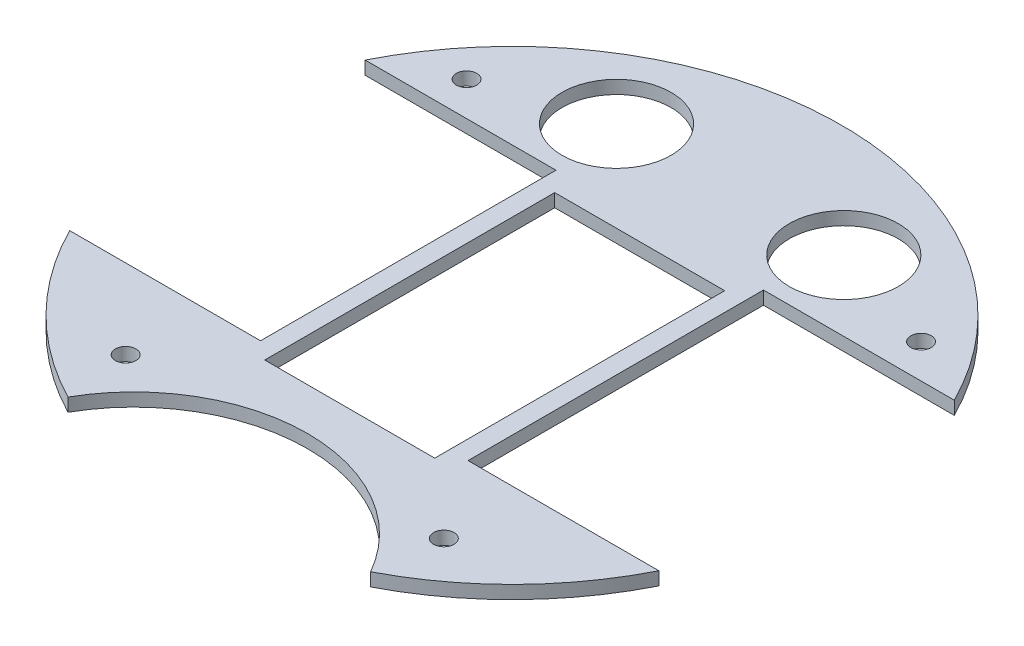
ISO-10303-21;
HEADER;
FILE_DESCRIPTION(('STEP AP214'),'2;1');
FILE_NAME('part.step','',(''),(''),'','','');
FILE_SCHEMA(('AUTOMOTIVE_DESIGN { 1 0 10303 214 1 1 1 1 }'));
ENDSEC;
DATA;
#1=APPLICATION_CONTEXT('core data for automotive mechanical design processes');
#2=APPLICATION_PROTOCOL_DEFINITION('international standard','automotive_design',2000,#1);
#3=PRODUCT_CONTEXT('',#1,'mechanical');
#4=PRODUCT('Part','Part','',(#3));
#5=PRODUCT_RELATED_PRODUCT_CATEGORY('part','',(#4));
#6=PRODUCT_DEFINITION_FORMATION('','',#4);
#7=PRODUCT_DEFINITION_CONTEXT('part definition',#1,'design');
#8=PRODUCT_DEFINITION('design','',#6,#7);
#9=PRODUCT_DEFINITION_SHAPE('','',#8);
#10=(LENGTH_UNIT() NAMED_UNIT(*) SI_UNIT(.MILLI.,.METRE.));
#11=(NAMED_UNIT(*) PLANE_ANGLE_UNIT() SI_UNIT($,.RADIAN.));
#12=(NAMED_UNIT(*) SI_UNIT($,.STERADIAN.) SOLID_ANGLE_UNIT());
#13=UNCERTAINTY_MEASURE_WITH_UNIT(LENGTH_MEASURE(1.E-05),#10,'distance_accuracy_value','');
#14=(GEOMETRIC_REPRESENTATION_CONTEXT(3) GLOBAL_UNCERTAINTY_ASSIGNED_CONTEXT((#13)) GLOBAL_UNIT_ASSIGNED_CONTEXT((#10,
#11,#12)) REPRESENTATION_CONTEXT('',''));
#15=CARTESIAN_POINT('',(0.,0.,0.));
#16=DIRECTION('',(0.,0.,1.));
#17=DIRECTION('',(1.,0.,0.));
#18=AXIS2_PLACEMENT_3D('',#15,#16,#17);
#19=CARTESIAN_POINT('',(0.,2.9,0.));
#20=DIRECTION('',(0.,-1.,0.));
#21=DIRECTION('',(0.,0.,-1.));
#22=AXIS2_PLACEMENT_3D('',#19,#20,#21);
#23=CYLINDRICAL_SURFACE('',#22,72.5);
#24=CARTESIAN_POINT('',(0.,0.,0.));
#25=DIRECTION('',(0.,1.,0.));
#26=DIRECTION('',(0.,0.,1.));
#27=AXIS2_PLACEMENT_3D('',#24,#25,#26);
#28=CIRCLE('',#27,72.5);
#29=CARTESIAN_POINT('',(33.2911053697012,0.,64.4045984636458));
#30=VERTEX_POINT('',#29);
#31=CARTESIAN_POINT('',(64.8074069840786,0.,32.4999999999999));
#32=VERTEX_POINT('',#31);
#33=EDGE_CURVE('E156',#30,#32,#28,.T.);
#34=ORIENTED_EDGE('',*,*,#33,.T.);
#35=DIRECTION('',(0.,1.,0.));
#36=VECTOR('',#35,1.);
#37=CARTESIAN_POINT('',(64.8074069840786,0.,32.4999999999999));
#38=LINE('',#37,#36);
#39=CARTESIAN_POINT('',(64.8074069840786,2.9,32.4999999999999));
#40=VERTEX_POINT('',#39);
#41=EDGE_CURVE('E231',#32,#40,#38,.T.);
#42=ORIENTED_EDGE('',*,*,#41,.T.);
#43=CARTESIAN_POINT('',(0.,2.9,0.));
#44=DIRECTION('',(0.,1.,0.));
#45=DIRECTION('',(0.,0.,1.));
#46=AXIS2_PLACEMENT_3D('',#43,#44,#45);
#47=CIRCLE('',#46,72.5);
#48=CARTESIAN_POINT('',(33.2911053697012,2.9,64.4045984636458));
#49=VERTEX_POINT('',#48);
#50=EDGE_CURVE('E165',#49,#40,#47,.T.);
#51=ORIENTED_EDGE('',*,*,#50,.F.);
#52=DIRECTION('',(0.,-1.,0.));
#53=VECTOR('',#52,1.);
#54=CARTESIAN_POINT('',(33.2911053697012,2.9,64.4045984636458));
#55=LINE('',#54,#53);
#56=EDGE_CURVE('E11',#49,#30,#55,.T.);
#57=ORIENTED_EDGE('',*,*,#56,.T.);
#58=EDGE_LOOP('',(#34,#42,#51,#57));
#59=FACE_BOUND('',#58,.T.);
#60=ADVANCED_FACE('F32',(#59),#23,.T.);
#61=CARTESIAN_POINT('',(64.8074069840786,2.9,-32.5));
#62=VERTEX_POINT('',#61);
#63=CARTESIAN_POINT('',(-64.8074069840786,2.9,-32.5));
#64=VERTEX_POINT('',#63);
#65=EDGE_CURVE('E149',#62,#64,#47,.T.);
#66=ORIENTED_EDGE('',*,*,#65,.F.);
#67=DIRECTION('',(0.,1.,0.));
#68=VECTOR('',#67,1.);
#69=CARTESIAN_POINT('',(64.8074069840786,0.,-32.5));
#70=LINE('',#69,#68);
#71=CARTESIAN_POINT('',(64.8074069840786,0.,-32.5));
#72=VERTEX_POINT('',#71);
#73=EDGE_CURVE('E136',#72,#62,#70,.T.);
#74=ORIENTED_EDGE('',*,*,#73,.F.);
#75=CARTESIAN_POINT('',(-64.8074069840786,0.,-32.5));
#76=VERTEX_POINT('',#75);
#77=EDGE_CURVE('E147',#72,#76,#28,.T.);
#78=ORIENTED_EDGE('',*,*,#77,.T.);
#79=DIRECTION('',(0.,1.,0.));
#80=VECTOR('',#79,1.);
#81=CARTESIAN_POINT('',(-64.8074069840786,0.,-32.5));
#82=LINE('',#81,#80);
#83=EDGE_CURVE('E218',#76,#64,#82,.T.);
#84=ORIENTED_EDGE('',*,*,#83,.T.);
#85=EDGE_LOOP('',(#66,#74,#78,#84));
#86=FACE_BOUND('',#85,.T.);
#87=ADVANCED_FACE('F145',(#86),#23,.T.);
#88=CARTESIAN_POINT('',(0.,2.9,83.2397996376034));
#89=DIRECTION('',(0.,-1.,0.));
#90=DIRECTION('',(0.,0.,-1.));
#91=AXIS2_PLACEMENT_3D('',#88,#89,#90);
#92=CYLINDRICAL_SURFACE('',#91,38.25);
#93=CARTESIAN_POINT('',(0.,0.,83.2397996376034));
#94=DIRECTION('',(0.,-1.,0.));
#95=DIRECTION('',(0.,0.,1.));
#96=AXIS2_PLACEMENT_3D('',#93,#94,#95);
#97=CIRCLE('',#96,38.25);
#98=CARTESIAN_POINT('',(-33.2911053697012,0.,64.4045984636458));
#99=VERTEX_POINT('',#98);
#100=EDGE_CURVE('E161',#99,#30,#97,.T.);
#101=ORIENTED_EDGE('',*,*,#100,.T.);
#102=ORIENTED_EDGE('',*,*,#56,.F.);
#103=CARTESIAN_POINT('',(0.,2.9,83.2397996376034));
#104=DIRECTION('',(0.,-1.,0.));
#105=DIRECTION('',(0.,0.,1.));
#106=AXIS2_PLACEMENT_3D('',#103,#104,#105);
#107=CIRCLE('',#106,38.25);
#108=CARTESIAN_POINT('',(-33.2911053697012,2.9,64.4045984636458));
#109=VERTEX_POINT('',#108);
#110=EDGE_CURVE('E160',#109,#49,#107,.T.);
#111=ORIENTED_EDGE('',*,*,#110,.F.);
#112=DIRECTION('',(0.,-1.,0.));
#113=VECTOR('',#112,1.);
#114=CARTESIAN_POINT('',(-33.2911053697012,2.9,64.4045984636458));
#115=LINE('',#114,#113);
#116=EDGE_CURVE('E40',#109,#99,#115,.T.);
#117=ORIENTED_EDGE('',*,*,#116,.T.);
#118=EDGE_LOOP('',(#101,#102,#111,#117));
#119=FACE_BOUND('',#118,.T.);
#120=ADVANCED_FACE('F34',(#119),#92,.F.);
#121=CARTESIAN_POINT('',(-64.8074069840787,2.9,32.4999999999999));
#122=VERTEX_POINT('',#121);
#123=EDGE_CURVE('E172',#122,#109,#47,.T.);
#124=ORIENTED_EDGE('',*,*,#123,.F.);
#125=DIRECTION('',(0.,1.,0.));
#126=VECTOR('',#125,1.);
#127=CARTESIAN_POINT('',(-64.8074069840787,0.,32.4999999999999));
#128=LINE('',#127,#126);
#129=CARTESIAN_POINT('',(-64.8074069840787,0.,32.4999999999999));
#130=VERTEX_POINT('',#129);
#131=EDGE_CURVE('E203',#130,#122,#128,.T.);
#132=ORIENTED_EDGE('',*,*,#131,.F.);
#133=EDGE_CURVE('E157',#130,#99,#28,.T.);
#134=ORIENTED_EDGE('',*,*,#133,.T.);
#135=ORIENTED_EDGE('',*,*,#116,.F.);
#136=EDGE_LOOP('',(#124,#132,#134,#135));
#137=FACE_BOUND('',#136,.T.);
#138=ADVANCED_FACE('F302',(#137),#23,.T.);
#139=CARTESIAN_POINT('',(0.,2.9,41.6198998188017));
#140=DIRECTION('',(0.,1.,0.));
#141=DIRECTION('',(0.,0.,1.));
#142=AXIS2_PLACEMENT_3D('',#139,#140,#141);
#143=PLANE('',#142);
#144=CARTESIAN_POINT('',(-35.,2.9,50.));
#145=DIRECTION('',(0.,1.,0.));
#146=DIRECTION('',(0.,0.,1.));
#147=AXIS2_PLACEMENT_3D('',#144,#145,#146);
#148=CIRCLE('',#147,2.25);
#149=CARTESIAN_POINT('',(-35.,2.9,52.25));
#150=VERTEX_POINT('',#149);
#151=EDGE_CURVE('E268',#150,#150,#148,.T.);
#152=ORIENTED_EDGE('',*,*,#151,.F.);
#153=EDGE_LOOP('',(#152));
#154=FACE_BOUND('',#153,.T.);
#155=CARTESIAN_POINT('',(-50.,2.9,-40.));
#156=DIRECTION('',(0.,1.,0.));
#157=DIRECTION('',(0.,0.,1.));
#158=AXIS2_PLACEMENT_3D('',#155,#156,#157);
#159=CIRCLE('',#158,2.25);
#160=CARTESIAN_POINT('',(-50.,2.9,-37.75));
#161=VERTEX_POINT('',#160);
#162=EDGE_CURVE('E271',#161,#161,#159,.T.);
#163=ORIENTED_EDGE('',*,*,#162,.F.);
#164=EDGE_LOOP('',(#163));
#165=FACE_BOUND('',#164,.T.);
#166=CARTESIAN_POINT('',(50.,2.9,-40.));
#167=DIRECTION('',(0.,1.,0.));
#168=DIRECTION('',(0.,0.,1.));
#169=AXIS2_PLACEMENT_3D('',#166,#167,#168);
#170=CIRCLE('',#169,2.25);
#171=CARTESIAN_POINT('',(50.,2.9,-37.75));
#172=VERTEX_POINT('',#171);
#173=EDGE_CURVE('E274',#172,#172,#170,.T.);
#174=ORIENTED_EDGE('',*,*,#173,.F.);
#175=EDGE_LOOP('',(#174));
#176=FACE_BOUND('',#175,.T.);
#177=CARTESIAN_POINT('',(35.,2.9,50.));
#178=DIRECTION('',(0.,1.,0.));
#179=DIRECTION('',(0.,0.,1.));
#180=AXIS2_PLACEMENT_3D('',#177,#178,#179);
#181=CIRCLE('',#180,2.25);
#182=CARTESIAN_POINT('',(35.,2.9,52.25));
#183=VERTEX_POINT('',#182);
#184=EDGE_CURVE('E260',#183,#183,#181,.T.);
#185=ORIENTED_EDGE('',*,*,#184,.F.);
#186=EDGE_LOOP('',(#185));
#187=FACE_BOUND('',#186,.T.);
#188=CARTESIAN_POINT('',(-25.,2.9,-48.));
#189=DIRECTION('',(0.,1.,0.));
#190=DIRECTION('',(0.,0.,1.));
#191=AXIS2_PLACEMENT_3D('',#188,#189,#190);
#192=CIRCLE('',#191,12.);
#193=CARTESIAN_POINT('',(-25.,2.9,-36.));
#194=VERTEX_POINT('',#193);
#195=EDGE_CURVE('E257',#194,#194,#192,.T.);
#196=ORIENTED_EDGE('',*,*,#195,.F.);
#197=EDGE_LOOP('',(#196));
#198=FACE_BOUND('',#197,.T.);
#199=CARTESIAN_POINT('',(25.,2.9,-48.));
#200=DIRECTION('',(0.,1.,0.));
#201=DIRECTION('',(0.,0.,1.));
#202=AXIS2_PLACEMENT_3D('',#199,#200,#201);
#203=CIRCLE('',#202,12.);
#204=CARTESIAN_POINT('',(25.,2.9,-36.));
#205=VERTEX_POINT('',#204);
#206=EDGE_CURVE('E251',#205,#205,#203,.T.);
#207=ORIENTED_EDGE('',*,*,#206,.F.);
#208=EDGE_LOOP('',(#207));
#209=FACE_BOUND('',#208,.T.);
#210=DIRECTION('',(1.,0.,0.));
#211=VECTOR('',#210,1.);
#212=CARTESIAN_POINT('',(34.6299999999999,2.9,32.5));
#213=LINE('',#212,#211);
#214=CARTESIAN_POINT('',(22.8299999999999,2.9,32.4999999999999));
#215=VERTEX_POINT('',#214);
#216=EDGE_CURVE('E141',#215,#40,#213,.T.);
#217=ORIENTED_EDGE('',*,*,#216,.F.);
#218=DIRECTION('',(0.,0.,1.));
#219=VECTOR('',#218,1.);
#220=CARTESIAN_POINT('',(22.8299999999999,2.9,-32.5));
#221=LINE('',#220,#219);
#222=CARTESIAN_POINT('',(22.8299999999999,2.9,-32.5));
#223=VERTEX_POINT('',#222);
#224=EDGE_CURVE('E242',#223,#215,#221,.T.);
#225=ORIENTED_EDGE('',*,*,#224,.F.);
#226=DIRECTION('',(-1.,0.,0.));
#227=VECTOR('',#226,1.);
#228=CARTESIAN_POINT('',(64.8074069840786,2.9,-32.5));
#229=LINE('',#228,#227);
#230=EDGE_CURVE('E245',#62,#223,#229,.T.);
#231=ORIENTED_EDGE('',*,*,#230,.F.);
#232=ORIENTED_EDGE('',*,*,#65,.T.);
#233=DIRECTION('',(-1.,0.,0.));
#234=VECTOR('',#233,1.);
#235=CARTESIAN_POINT('',(-22.8299999999999,2.9,-32.5));
#236=LINE('',#235,#234);
#237=CARTESIAN_POINT('',(-22.8299999999999,2.9,-32.5));
#238=VERTEX_POINT('',#237);
#239=EDGE_CURVE('E221',#238,#64,#236,.T.);
#240=ORIENTED_EDGE('',*,*,#239,.F.);
#241=DIRECTION('',(0.,0.,-1.));
#242=VECTOR('',#241,1.);
#243=CARTESIAN_POINT('',(-22.8299999999999,2.9,32.4999999999999));
#244=LINE('',#243,#242);
#245=CARTESIAN_POINT('',(-22.8299999999999,2.9,32.4999999999999));
#246=VERTEX_POINT('',#245);
#247=EDGE_CURVE('E225',#246,#238,#244,.T.);
#248=ORIENTED_EDGE('',*,*,#247,.F.);
#249=DIRECTION('',(1.,0.,0.));
#250=VECTOR('',#249,1.);
#251=CARTESIAN_POINT('',(-34.6299999999999,2.9,32.5));
#252=LINE('',#251,#250);
#253=EDGE_CURVE('E228',#122,#246,#252,.T.);
#254=ORIENTED_EDGE('',*,*,#253,.F.);
#255=ORIENTED_EDGE('',*,*,#123,.T.);
#256=ORIENTED_EDGE('',*,*,#110,.T.);
#257=ORIENTED_EDGE('',*,*,#50,.T.);
#258=EDGE_LOOP('',(#217,#225,#231,#232,#240,#248,#254,#255,#256,#257));
#259=FACE_BOUND('',#258,.T.);
#260=DIRECTION('',(0.,0.,1.));
#261=VECTOR('',#260,1.);
#262=CARTESIAN_POINT('',(-18.7,2.9,-28.1));
#263=LINE('',#262,#261);
#264=CARTESIAN_POINT('',(-18.7,2.9,-28.1));
#265=VERTEX_POINT('',#264);
#266=CARTESIAN_POINT('',(-18.7,2.9,35.7));
#267=VERTEX_POINT('',#266);
#268=EDGE_CURVE('E201',#265,#267,#263,.T.);
#269=ORIENTED_EDGE('',*,*,#268,.F.);
#270=DIRECTION('',(-1.,0.,0.));
#271=VECTOR('',#270,1.);
#272=CARTESIAN_POINT('',(18.7,2.9,-28.1));
#273=LINE('',#272,#271);
#274=CARTESIAN_POINT('',(18.7,2.9,-28.1));
#275=VERTEX_POINT('',#274);
#276=EDGE_CURVE('E191',#275,#265,#273,.T.);
#277=ORIENTED_EDGE('',*,*,#276,.F.);
#278=DIRECTION('',(0.,0.,-1.));
#279=VECTOR('',#278,1.);
#280=CARTESIAN_POINT('',(18.7,2.9,35.7));
#281=LINE('',#280,#279);
#282=CARTESIAN_POINT('',(18.7,2.9,35.7));
#283=VERTEX_POINT('',#282);
#284=EDGE_CURVE('E195',#283,#275,#281,.T.);
#285=ORIENTED_EDGE('',*,*,#284,.F.);
#286=DIRECTION('',(1.,0.,0.));
#287=VECTOR('',#286,1.);
#288=CARTESIAN_POINT('',(-18.7,2.9,35.7));
#289=LINE('',#288,#287);
#290=EDGE_CURVE('E198',#267,#283,#289,.T.);
#291=ORIENTED_EDGE('',*,*,#290,.F.);
#292=EDGE_LOOP('',(#269,#277,#285,#291));
#293=FACE_BOUND('',#292,.T.);
#294=ADVANCED_FACE('F308',(#154,#165,#176,#187,#198,#209,#259,#293),#143,.T.);
#295=CARTESIAN_POINT('',(0.,0.,41.6198998188017));
#296=DIRECTION('',(0.,1.,0.));
#297=DIRECTION('',(0.,0.,1.));
#298=AXIS2_PLACEMENT_3D('',#295,#296,#297);
#299=PLANE('',#298);
#300=CARTESIAN_POINT('',(-35.,0.,50.));
#301=DIRECTION('',(0.,1.,0.));
#302=DIRECTION('',(0.,0.,1.));
#303=AXIS2_PLACEMENT_3D('',#300,#301,#302);
#304=CIRCLE('',#303,2.25);
#305=CARTESIAN_POINT('',(-35.,0.,52.25));
#306=VERTEX_POINT('',#305);
#307=EDGE_CURVE('E277',#306,#306,#304,.T.);
#308=ORIENTED_EDGE('',*,*,#307,.T.);
#309=EDGE_LOOP('',(#308));
#310=FACE_BOUND('',#309,.T.);
#311=CARTESIAN_POINT('',(-50.,0.,-40.));
#312=DIRECTION('',(0.,1.,0.));
#313=DIRECTION('',(0.,0.,1.));
#314=AXIS2_PLACEMENT_3D('',#311,#312,#313);
#315=CIRCLE('',#314,2.25);
#316=CARTESIAN_POINT('',(-50.,0.,-37.75));
#317=VERTEX_POINT('',#316);
#318=EDGE_CURVE('E281',#317,#317,#315,.T.);
#319=ORIENTED_EDGE('',*,*,#318,.T.);
#320=EDGE_LOOP('',(#319));
#321=FACE_BOUND('',#320,.T.);
#322=CARTESIAN_POINT('',(50.,0.,-40.));
#323=DIRECTION('',(0.,1.,0.));
#324=DIRECTION('',(0.,0.,1.));
#325=AXIS2_PLACEMENT_3D('',#322,#323,#324);
#326=CIRCLE('',#325,2.25);
#327=CARTESIAN_POINT('',(50.,0.,-37.75));
#328=VERTEX_POINT('',#327);
#329=EDGE_CURVE('E278',#328,#328,#326,.T.);
#330=ORIENTED_EDGE('',*,*,#329,.T.);
#331=EDGE_LOOP('',(#330));
#332=FACE_BOUND('',#331,.T.);
#333=CARTESIAN_POINT('',(35.,0.,50.));
#334=DIRECTION('',(0.,1.,0.));
#335=DIRECTION('',(0.,0.,1.));
#336=AXIS2_PLACEMENT_3D('',#333,#334,#335);
#337=CIRCLE('',#336,2.25);
#338=CARTESIAN_POINT('',(35.,0.,52.25));
#339=VERTEX_POINT('',#338);
#340=EDGE_CURVE('E265',#339,#339,#337,.T.);
#341=ORIENTED_EDGE('',*,*,#340,.T.);
#342=EDGE_LOOP('',(#341));
#343=FACE_BOUND('',#342,.T.);
#344=CARTESIAN_POINT('',(-25.,0.,-48.));
#345=DIRECTION('',(0.,1.,0.));
#346=DIRECTION('',(0.,0.,1.));
#347=AXIS2_PLACEMENT_3D('',#344,#345,#346);
#348=CIRCLE('',#347,12.);
#349=CARTESIAN_POINT('',(-25.,0.,-36.));
#350=VERTEX_POINT('',#349);
#351=EDGE_CURVE('E254',#350,#350,#348,.T.);
#352=ORIENTED_EDGE('',*,*,#351,.T.);
#353=EDGE_LOOP('',(#352));
#354=FACE_BOUND('',#353,.T.);
#355=CARTESIAN_POINT('',(25.,0.,-48.));
#356=DIRECTION('',(0.,1.,0.));
#357=DIRECTION('',(0.,0.,1.));
#358=AXIS2_PLACEMENT_3D('',#355,#356,#357);
#359=CIRCLE('',#358,12.);
#360=CARTESIAN_POINT('',(25.,0.,-36.));
#361=VERTEX_POINT('',#360);
#362=EDGE_CURVE('E247',#361,#361,#359,.T.);
#363=ORIENTED_EDGE('',*,*,#362,.T.);
#364=EDGE_LOOP('',(#363));
#365=FACE_BOUND('',#364,.T.);
#366=DIRECTION('',(-1.,0.,0.));
#367=VECTOR('',#366,1.);
#368=CARTESIAN_POINT('',(18.7,0.,-28.1));
#369=LINE('',#368,#367);
#370=CARTESIAN_POINT('',(18.7,0.,-28.1));
#371=VERTEX_POINT('',#370);
#372=CARTESIAN_POINT('',(-18.7,0.,-28.1));
#373=VERTEX_POINT('',#372);
#374=EDGE_CURVE('E185',#371,#373,#369,.T.);
#375=ORIENTED_EDGE('',*,*,#374,.T.);
#376=DIRECTION('',(0.,0.,1.));
#377=VECTOR('',#376,1.);
#378=CARTESIAN_POINT('',(-18.7,0.,-28.1));
#379=LINE('',#378,#377);
#380=CARTESIAN_POINT('',(-18.7,0.,35.7));
#381=VERTEX_POINT('',#380);
#382=EDGE_CURVE('E194',#373,#381,#379,.T.);
#383=ORIENTED_EDGE('',*,*,#382,.T.);
#384=DIRECTION('',(1.,0.,0.));
#385=VECTOR('',#384,1.);
#386=CARTESIAN_POINT('',(-18.7,0.,35.7));
#387=LINE('',#386,#385);
#388=CARTESIAN_POINT('',(18.7,0.,35.7));
#389=VERTEX_POINT('',#388);
#390=EDGE_CURVE('E209',#381,#389,#387,.T.);
#391=ORIENTED_EDGE('',*,*,#390,.T.);
#392=DIRECTION('',(0.,0.,-1.));
#393=VECTOR('',#392,1.);
#394=CARTESIAN_POINT('',(18.7,0.,35.7));
#395=LINE('',#394,#393);
#396=EDGE_CURVE('E206',#389,#371,#395,.T.);
#397=ORIENTED_EDGE('',*,*,#396,.T.);
#398=EDGE_LOOP('',(#375,#383,#391,#397));
#399=FACE_BOUND('',#398,.T.);
#400=DIRECTION('',(0.,0.,1.));
#401=VECTOR('',#400,1.);
#402=CARTESIAN_POINT('',(22.8299999999999,0.,-32.5));
#403=LINE('',#402,#401);
#404=CARTESIAN_POINT('',(22.8299999999999,0.,-32.5));
#405=VERTEX_POINT('',#404);
#406=CARTESIAN_POINT('',(22.8299999999999,0.,32.4999999999999));
#407=VERTEX_POINT('',#406);
#408=EDGE_CURVE('E47',#405,#407,#403,.T.);
#409=ORIENTED_EDGE('',*,*,#408,.T.);
#410=DIRECTION('',(1.,0.,0.));
#411=VECTOR('',#410,1.);
#412=CARTESIAN_POINT('',(22.8299999999999,0.,32.4999999999999));
#413=LINE('',#412,#411);
#414=EDGE_CURVE('E150',#407,#32,#413,.T.);
#415=ORIENTED_EDGE('',*,*,#414,.T.);
#416=ORIENTED_EDGE('',*,*,#33,.F.);
#417=ORIENTED_EDGE('',*,*,#100,.F.);
#418=ORIENTED_EDGE('',*,*,#133,.F.);
#419=DIRECTION('',(1.,0.,0.));
#420=VECTOR('',#419,1.);
#421=CARTESIAN_POINT('',(-64.8074069840786,0.,32.4999999999999));
#422=LINE('',#421,#420);
#423=CARTESIAN_POINT('',(-22.8299999999999,0.,32.4999999999999));
#424=VERTEX_POINT('',#423);
#425=EDGE_CURVE('E224',#130,#424,#422,.T.);
#426=ORIENTED_EDGE('',*,*,#425,.T.);
#427=DIRECTION('',(0.,0.,-1.));
#428=VECTOR('',#427,1.);
#429=CARTESIAN_POINT('',(-22.8299999999999,0.,32.4999999999999));
#430=LINE('',#429,#428);
#431=CARTESIAN_POINT('',(-22.8299999999999,0.,-32.5));
#432=VERTEX_POINT('',#431);
#433=EDGE_CURVE('E55',#424,#432,#430,.T.);
#434=ORIENTED_EDGE('',*,*,#433,.T.);
#435=DIRECTION('',(-1.,0.,0.));
#436=VECTOR('',#435,1.);
#437=CARTESIAN_POINT('',(-22.8299999999999,0.,-32.5));
#438=LINE('',#437,#436);
#439=EDGE_CURVE('E155',#432,#76,#438,.T.);
#440=ORIENTED_EDGE('',*,*,#439,.T.);
#441=ORIENTED_EDGE('',*,*,#77,.F.);
#442=DIRECTION('',(-1.,0.,0.));
#443=VECTOR('',#442,1.);
#444=CARTESIAN_POINT('',(64.8074069840786,0.,-32.5));
#445=LINE('',#444,#443);
#446=EDGE_CURVE('E132',#72,#405,#445,.T.);
#447=ORIENTED_EDGE('',*,*,#446,.T.);
#448=EDGE_LOOP('',(#409,#415,#416,#417,#418,#426,#434,#440,#441,#447));
#449=FACE_BOUND('',#448,.T.);
#450=ADVANCED_FACE('F153',(#310,#321,#332,#343,#354,#365,#399,#449),#299,.F.);
#451=CARTESIAN_POINT('',(-18.7,0.,-28.1));
#452=DIRECTION('',(-1.,0.,0.));
#453=DIRECTION('',(0.,0.,1.));
#454=AXIS2_PLACEMENT_3D('',#451,#452,#453);
#455=PLANE('',#454);
#456=ORIENTED_EDGE('',*,*,#268,.T.);
#457=DIRECTION('',(0.,1.,0.));
#458=VECTOR('',#457,1.);
#459=CARTESIAN_POINT('',(-18.7,0.,35.7));
#460=LINE('',#459,#458);
#461=EDGE_CURVE('E181',#381,#267,#460,.T.);
#462=ORIENTED_EDGE('',*,*,#461,.F.);
#463=ORIENTED_EDGE('',*,*,#382,.F.);
#464=DIRECTION('',(0.,1.,0.));
#465=VECTOR('',#464,1.);
#466=CARTESIAN_POINT('',(-18.7,0.,-28.1));
#467=LINE('',#466,#465);
#468=EDGE_CURVE('E189',#373,#265,#467,.T.);
#469=ORIENTED_EDGE('',*,*,#468,.T.);
#470=EDGE_LOOP('',(#456,#462,#463,#469));
#471=FACE_BOUND('',#470,.T.);
#472=ADVANCED_FACE('F348',(#471),#455,.F.);
#473=CARTESIAN_POINT('',(18.7,0.,-28.1));
#474=DIRECTION('',(0.,0.,-1.));
#475=DIRECTION('',(-1.,0.,0.));
#476=AXIS2_PLACEMENT_3D('',#473,#474,#475);
#477=PLANE('',#476);
#478=ORIENTED_EDGE('',*,*,#276,.T.);
#479=ORIENTED_EDGE('',*,*,#468,.F.);
#480=ORIENTED_EDGE('',*,*,#374,.F.);
#481=DIRECTION('',(0.,1.,0.));
#482=VECTOR('',#481,1.);
#483=CARTESIAN_POINT('',(18.7,0.,-28.1));
#484=LINE('',#483,#482);
#485=EDGE_CURVE('E187',#371,#275,#484,.T.);
#486=ORIENTED_EDGE('',*,*,#485,.T.);
#487=EDGE_LOOP('',(#478,#479,#480,#486));
#488=FACE_BOUND('',#487,.T.);
#489=ADVANCED_FACE('F345',(#488),#477,.F.);
#490=CARTESIAN_POINT('',(18.7,0.,35.7));
#491=DIRECTION('',(1.,0.,0.));
#492=DIRECTION('',(0.,0.,-1.));
#493=AXIS2_PLACEMENT_3D('',#490,#491,#492);
#494=PLANE('',#493);
#495=ORIENTED_EDGE('',*,*,#284,.T.);
#496=ORIENTED_EDGE('',*,*,#485,.F.);
#497=ORIENTED_EDGE('',*,*,#396,.F.);
#498=DIRECTION('',(0.,1.,0.));
#499=VECTOR('',#498,1.);
#500=CARTESIAN_POINT('',(18.7,0.,35.7));
#501=LINE('',#500,#499);
#502=EDGE_CURVE('E184',#389,#283,#501,.T.);
#503=ORIENTED_EDGE('',*,*,#502,.T.);
#504=EDGE_LOOP('',(#495,#496,#497,#503));
#505=FACE_BOUND('',#504,.T.);
#506=ADVANCED_FACE('F337',(#505),#494,.F.);
#507=CARTESIAN_POINT('',(-18.7,0.,35.7));
#508=DIRECTION('',(0.,0.,1.));
#509=DIRECTION('',(1.,0.,0.));
#510=AXIS2_PLACEMENT_3D('',#507,#508,#509);
#511=PLANE('',#510);
#512=ORIENTED_EDGE('',*,*,#290,.T.);
#513=ORIENTED_EDGE('',*,*,#502,.F.);
#514=ORIENTED_EDGE('',*,*,#390,.F.);
#515=ORIENTED_EDGE('',*,*,#461,.T.);
#516=EDGE_LOOP('',(#512,#513,#514,#515));
#517=FACE_BOUND('',#516,.T.);
#518=ADVANCED_FACE('F330',(#517),#511,.F.);
#519=CARTESIAN_POINT('',(-22.8299999999999,0.,-32.5));
#520=DIRECTION('',(0.,0.,-1.));
#521=DIRECTION('',(-1.,0.,0.));
#522=AXIS2_PLACEMENT_3D('',#519,#520,#521);
#523=PLANE('',#522);
#524=ORIENTED_EDGE('',*,*,#239,.T.);
#525=ORIENTED_EDGE('',*,*,#83,.F.);
#526=ORIENTED_EDGE('',*,*,#439,.F.);
#527=DIRECTION('',(0.,1.,0.));
#528=VECTOR('',#527,1.);
#529=CARTESIAN_POINT('',(-22.8299999999999,0.,-32.5));
#530=LINE('',#529,#528);
#531=EDGE_CURVE('E216',#432,#238,#530,.T.);
#532=ORIENTED_EDGE('',*,*,#531,.T.);
#533=EDGE_LOOP('',(#524,#525,#526,#532));
#534=FACE_BOUND('',#533,.T.);
#535=ADVANCED_FACE('F328',(#534),#523,.F.);
#536=CARTESIAN_POINT('',(-22.8299999999999,0.,32.4999999999999));
#537=DIRECTION('',(1.,0.,0.));
#538=DIRECTION('',(0.,0.,-1.));
#539=AXIS2_PLACEMENT_3D('',#536,#537,#538);
#540=PLANE('',#539);
#541=ORIENTED_EDGE('',*,*,#247,.T.);
#542=ORIENTED_EDGE('',*,*,#531,.F.);
#543=ORIENTED_EDGE('',*,*,#433,.F.);
#544=DIRECTION('',(0.,1.,0.));
#545=VECTOR('',#544,1.);
#546=CARTESIAN_POINT('',(-22.8299999999999,0.,32.4999999999999));
#547=LINE('',#546,#545);
#548=EDGE_CURVE('E214',#424,#246,#547,.T.);
#549=ORIENTED_EDGE('',*,*,#548,.T.);
#550=EDGE_LOOP('',(#541,#542,#543,#549));
#551=FACE_BOUND('',#550,.T.);
#552=ADVANCED_FACE('F324',(#551),#540,.F.);
#553=CARTESIAN_POINT('',(-34.6299999999999,0.,32.5));
#554=DIRECTION('',(0.,0.,1.));
#555=DIRECTION('',(1.,0.,0.));
#556=AXIS2_PLACEMENT_3D('',#553,#554,#555);
#557=PLANE('',#556);
#558=ORIENTED_EDGE('',*,*,#253,.T.);
#559=ORIENTED_EDGE('',*,*,#548,.F.);
#560=ORIENTED_EDGE('',*,*,#425,.F.);
#561=ORIENTED_EDGE('',*,*,#131,.T.);
#562=EDGE_LOOP('',(#558,#559,#560,#561));
#563=FACE_BOUND('',#562,.T.);
#564=ADVANCED_FACE('F322',(#563),#557,.F.);
#565=CARTESIAN_POINT('',(34.6299999999999,0.,32.5));
#566=DIRECTION('',(0.,0.,1.));
#567=DIRECTION('',(1.,0.,0.));
#568=AXIS2_PLACEMENT_3D('',#565,#566,#567);
#569=PLANE('',#568);
#570=ORIENTED_EDGE('',*,*,#216,.T.);
#571=ORIENTED_EDGE('',*,*,#41,.F.);
#572=ORIENTED_EDGE('',*,*,#414,.F.);
#573=DIRECTION('',(0.,1.,0.));
#574=VECTOR('',#573,1.);
#575=CARTESIAN_POINT('',(22.8299999999999,0.,32.4999999999999));
#576=LINE('',#575,#574);
#577=EDGE_CURVE('E237',#407,#215,#576,.T.);
#578=ORIENTED_EDGE('',*,*,#577,.T.);
#579=EDGE_LOOP('',(#570,#571,#572,#578));
#580=FACE_BOUND('',#579,.T.);
#581=ADVANCED_FACE('F320',(#580),#569,.F.);
#582=CARTESIAN_POINT('',(22.8299999999999,0.,-32.5));
#583=DIRECTION('',(-1.,0.,0.));
#584=DIRECTION('',(0.,0.,1.));
#585=AXIS2_PLACEMENT_3D('',#582,#583,#584);
#586=PLANE('',#585);
#587=ORIENTED_EDGE('',*,*,#224,.T.);
#588=ORIENTED_EDGE('',*,*,#577,.F.);
#589=ORIENTED_EDGE('',*,*,#408,.F.);
#590=DIRECTION('',(0.,1.,0.));
#591=VECTOR('',#590,1.);
#592=CARTESIAN_POINT('',(22.8299999999999,0.,-32.5));
#593=LINE('',#592,#591);
#594=EDGE_CURVE('E138',#405,#223,#593,.T.);
#595=ORIENTED_EDGE('',*,*,#594,.T.);
#596=EDGE_LOOP('',(#587,#588,#589,#595));
#597=FACE_BOUND('',#596,.T.);
#598=ADVANCED_FACE('F421',(#597),#586,.F.);
#599=CARTESIAN_POINT('',(64.8074069840786,0.,-32.5));
#600=DIRECTION('',(0.,0.,-1.));
#601=DIRECTION('',(-1.,0.,0.));
#602=AXIS2_PLACEMENT_3D('',#599,#600,#601);
#603=PLANE('',#602);
#604=ORIENTED_EDGE('',*,*,#230,.T.);
#605=ORIENTED_EDGE('',*,*,#594,.F.);
#606=ORIENTED_EDGE('',*,*,#446,.F.);
#607=ORIENTED_EDGE('',*,*,#73,.T.);
#608=EDGE_LOOP('',(#604,#605,#606,#607));
#609=FACE_BOUND('',#608,.T.);
#610=ADVANCED_FACE('F135',(#609),#603,.F.);
#611=CARTESIAN_POINT('',(25.,0.,-48.));
#612=DIRECTION('',(0.,1.,0.));
#613=DIRECTION('',(0.,0.,1.));
#614=AXIS2_PLACEMENT_3D('',#611,#612,#613);
#615=CYLINDRICAL_SURFACE('',#614,12.);
#616=ORIENTED_EDGE('',*,*,#362,.F.);
#617=EDGE_LOOP('',(#616));
#618=FACE_BOUND('',#617,.T.);
#619=ORIENTED_EDGE('',*,*,#206,.T.);
#620=EDGE_LOOP('',(#619));
#621=FACE_BOUND('',#620,.T.);
#622=ADVANCED_FACE('F437',(#618,#621),#615,.F.);
#623=CARTESIAN_POINT('',(-25.,0.,-48.));
#624=DIRECTION('',(0.,1.,0.));
#625=DIRECTION('',(0.,0.,1.));
#626=AXIS2_PLACEMENT_3D('',#623,#624,#625);
#627=CYLINDRICAL_SURFACE('',#626,12.);
#628=ORIENTED_EDGE('',*,*,#351,.F.);
#629=EDGE_LOOP('',(#628));
#630=FACE_BOUND('',#629,.T.);
#631=ORIENTED_EDGE('',*,*,#195,.T.);
#632=EDGE_LOOP('',(#631));
#633=FACE_BOUND('',#632,.T.);
#634=ADVANCED_FACE('F445',(#630,#633),#627,.F.);
#635=CARTESIAN_POINT('',(35.,0.,50.));
#636=DIRECTION('',(0.,1.,0.));
#637=DIRECTION('',(0.,0.,1.));
#638=AXIS2_PLACEMENT_3D('',#635,#636,#637);
#639=CYLINDRICAL_SURFACE('',#638,2.25);
#640=ORIENTED_EDGE('',*,*,#184,.T.);
#641=EDGE_LOOP('',(#640));
#642=FACE_BOUND('',#641,.T.);
#643=ORIENTED_EDGE('',*,*,#340,.F.);
#644=EDGE_LOOP('',(#643));
#645=FACE_BOUND('',#644,.T.);
#646=ADVANCED_FACE('F454',(#642,#645),#639,.F.);
#647=CARTESIAN_POINT('',(50.,0.,-40.));
#648=DIRECTION('',(0.,1.,0.));
#649=DIRECTION('',(0.,0.,1.));
#650=AXIS2_PLACEMENT_3D('',#647,#648,#649);
#651=CYLINDRICAL_SURFACE('',#650,2.25);
#652=ORIENTED_EDGE('',*,*,#173,.T.);
#653=EDGE_LOOP('',(#652));
#654=FACE_BOUND('',#653,.T.);
#655=ORIENTED_EDGE('',*,*,#329,.F.);
#656=EDGE_LOOP('',(#655));
#657=FACE_BOUND('',#656,.T.);
#658=ADVANCED_FACE('F297',(#654,#657),#651,.F.);
#659=CARTESIAN_POINT('',(-50.,0.,-40.));
#660=DIRECTION('',(0.,1.,0.));
#661=DIRECTION('',(0.,0.,1.));
#662=AXIS2_PLACEMENT_3D('',#659,#660,#661);
#663=CYLINDRICAL_SURFACE('',#662,2.25);
#664=ORIENTED_EDGE('',*,*,#162,.T.);
#665=EDGE_LOOP('',(#664));
#666=FACE_BOUND('',#665,.T.);
#667=ORIENTED_EDGE('',*,*,#318,.F.);
#668=EDGE_LOOP('',(#667));
#669=FACE_BOUND('',#668,.T.);
#670=ADVANCED_FACE('F291',(#666,#669),#663,.F.);
#671=CARTESIAN_POINT('',(-35.,0.,50.));
#672=DIRECTION('',(0.,1.,0.));
#673=DIRECTION('',(0.,0.,1.));
#674=AXIS2_PLACEMENT_3D('',#671,#672,#673);
#675=CYLINDRICAL_SURFACE('',#674,2.25);
#676=ORIENTED_EDGE('',*,*,#151,.T.);
#677=EDGE_LOOP('',(#676));
#678=FACE_BOUND('',#677,.T.);
#679=ORIENTED_EDGE('',*,*,#307,.F.);
#680=EDGE_LOOP('',(#679));
#681=FACE_BOUND('',#680,.T.);
#682=ADVANCED_FACE('F289',(#678,#681),#675,.F.);
#683=CLOSED_SHELL('',(#60,#87,#120,#138,#294,#450,#472,#489,#506,#518,#535,#552,#564,#581,#598,
#610,#622,#634,#646,#658,#670,#682));
#684=MANIFOLD_SOLID_BREP('B2',#683);
#685=ADVANCED_BREP_SHAPE_REPRESENTATION('',(#18,#684),#14);
#686=SHAPE_DEFINITION_REPRESENTATION(#9,#685);
ENDSEC;
END-ISO-10303-21;
